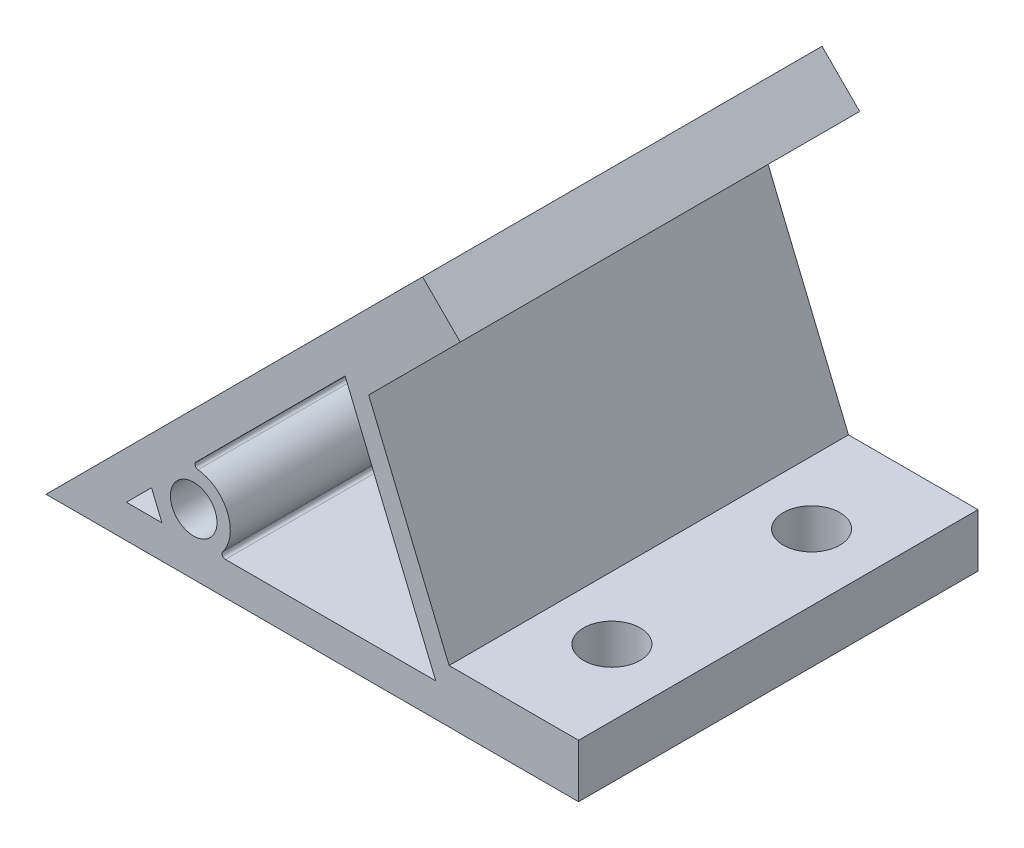
ISO-10303-21;
HEADER;
FILE_DESCRIPTION(('STEP AP214'),'2;1');
FILE_NAME('part.step','',(''),(''),'','','');
FILE_SCHEMA(('AUTOMOTIVE_DESIGN { 1 0 10303 214 1 1 1 1 }'));
ENDSEC;
DATA;
#1=APPLICATION_CONTEXT('core data for automotive mechanical design processes');
#2=APPLICATION_PROTOCOL_DEFINITION('international standard','automotive_design',2000,#1);
#3=PRODUCT_CONTEXT('',#1,'mechanical');
#4=PRODUCT('Part','Part','',(#3));
#5=PRODUCT_RELATED_PRODUCT_CATEGORY('part','',(#4));
#6=PRODUCT_DEFINITION_FORMATION('','',#4);
#7=PRODUCT_DEFINITION_CONTEXT('part definition',#1,'design');
#8=PRODUCT_DEFINITION('design','',#6,#7);
#9=PRODUCT_DEFINITION_SHAPE('','',#8);
#10=(LENGTH_UNIT() NAMED_UNIT(*) SI_UNIT(.MILLI.,.METRE.));
#11=(NAMED_UNIT(*) PLANE_ANGLE_UNIT() SI_UNIT($,.RADIAN.));
#12=(NAMED_UNIT(*) SI_UNIT($,.STERADIAN.) SOLID_ANGLE_UNIT());
#13=UNCERTAINTY_MEASURE_WITH_UNIT(LENGTH_MEASURE(1.E-05),#10,'distance_accuracy_value','');
#14=(GEOMETRIC_REPRESENTATION_CONTEXT(3) GLOBAL_UNCERTAINTY_ASSIGNED_CONTEXT((#13)) GLOBAL_UNIT_ASSIGNED_CONTEXT((#10,
#11,#12)) REPRESENTATION_CONTEXT('',''));
#15=CARTESIAN_POINT('',(0.,0.,0.));
#16=DIRECTION('',(0.,0.,1.));
#17=DIRECTION('',(1.,0.,0.));
#18=AXIS2_PLACEMENT_3D('',#15,#16,#17);
#19=CARTESIAN_POINT('',(80.,0.,30.));
#20=DIRECTION('',(0.,0.,1.));
#21=DIRECTION('',(1.,0.,0.));
#22=AXIS2_PLACEMENT_3D('',#19,#20,#21);
#23=PLANE('',#22);
#24=CARTESIAN_POINT('',(22.1846771867485,9.15647377294881,30.));
#25=DIRECTION('',(0.,0.,1.));
#26=DIRECTION('',(1.,0.,0.));
#27=AXIS2_PLACEMENT_3D('',#24,#25,#26);
#28=CIRCLE('',#27,3.5);
#29=CARTESIAN_POINT('',(25.6846771867485,9.15647377294881,30.));
#30=VERTEX_POINT('',#29);
#31=EDGE_CURVE('E199',#30,#30,#28,.T.);
#32=ORIENTED_EDGE('',*,*,#31,.F.);
#33=EDGE_LOOP('',(#32));
#34=FACE_BOUND('',#33,.T.);
#35=DIRECTION('',(1.,0.,0.));
#36=VECTOR('',#35,1.);
#37=CARTESIAN_POINT('',(0.,0.,30.));
#38=LINE('',#37,#36);
#39=CARTESIAN_POINT('',(0.,0.,30.));
#40=VERTEX_POINT('',#39);
#41=CARTESIAN_POINT('',(80.,0.,30.));
#42=VERTEX_POINT('',#41);
#43=EDGE_CURVE('E229',#40,#42,#38,.T.);
#44=ORIENTED_EDGE('',*,*,#43,.T.);
#45=DIRECTION('',(0.,1.,0.));
#46=VECTOR('',#45,1.);
#47=CARTESIAN_POINT('',(80.,0.,30.));
#48=LINE('',#47,#46);
#49=CARTESIAN_POINT('',(80.,8.,30.));
#50=VERTEX_POINT('',#49);
#51=EDGE_CURVE('E232',#42,#50,#48,.T.);
#52=ORIENTED_EDGE('',*,*,#51,.T.);
#53=DIRECTION('',(-1.,0.,0.));
#54=VECTOR('',#53,1.);
#55=CARTESIAN_POINT('',(60.5474313182664,8.,30.));
#56=LINE('',#55,#54);
#57=CARTESIAN_POINT('',(60.5474313182664,8.,30.));
#58=VERTEX_POINT('',#57);
#59=EDGE_CURVE('E235',#50,#58,#56,.T.);
#60=ORIENTED_EDGE('',*,*,#59,.T.);
#61=DIRECTION('',(-0.382683432365087,0.923879532511288,0.));
#62=VECTOR('',#61,1.);
#63=CARTESIAN_POINT('',(60.5474313182664,8.,30.));
#64=LINE('',#63,#62);
#65=CARTESIAN_POINT('',(48.4703535180654,37.1566450190806,30.));
#66=VERTEX_POINT('',#65);
#67=EDGE_CURVE('E237',#58,#66,#64,.T.);
#68=ORIENTED_EDGE('',*,*,#67,.T.);
#69=DIRECTION('',(0.707106781186547,0.707106781186548,0.));
#70=VECTOR('',#69,1.);
#71=CARTESIAN_POINT('',(48.4703535180654,37.1566450190806,30.));
#72=LINE('',#71,#70);
#73=CARTESIAN_POINT('',(62.2253967444162,50.9116882454314,30.));
#74=VERTEX_POINT('',#73);
#75=EDGE_CURVE('E239',#66,#74,#72,.T.);
#76=ORIENTED_EDGE('',*,*,#75,.T.);
#77=DIRECTION('',(-0.707106781186549,0.707106781186546,0.));
#78=VECTOR('',#77,1.);
#79=CARTESIAN_POINT('',(62.2253967444162,50.9116882454314,30.));
#80=LINE('',#79,#78);
#81=CARTESIAN_POINT('',(56.5685424949237,56.5685424949239,30.));
#82=VERTEX_POINT('',#81);
#83=EDGE_CURVE('E241',#74,#82,#80,.T.);
#84=ORIENTED_EDGE('',*,*,#83,.T.);
#85=DIRECTION('',(-0.707106781186546,-0.707106781186549,0.));
#86=VECTOR('',#85,1.);
#87=CARTESIAN_POINT('',(0.,0.,30.));
#88=LINE('',#87,#86);
#89=EDGE_CURVE('E243',#82,#40,#88,.T.);
#90=ORIENTED_EDGE('',*,*,#89,.T.);
#91=EDGE_LOOP('',(#44,#52,#60,#68,#76,#84,#90));
#92=FACE_BOUND('',#91,.T.);
#93=DIRECTION('',(-0.382683432365087,0.923879532511288,0.));
#94=VECTOR('',#93,1.);
#95=CARTESIAN_POINT('',(15.8476713770087,8.77660356514327,30.));
#96=LINE('',#95,#94);
#97=CARTESIAN_POINT('',(17.4119917933976,5.,30.));
#98=VERTEX_POINT('',#97);
#99=CARTESIAN_POINT('',(15.8476713770087,8.77660356514327,30.));
#100=VERTEX_POINT('',#99);
#101=EDGE_CURVE('E207',#98,#100,#96,.T.);
#102=ORIENTED_EDGE('',*,*,#101,.F.);
#103=DIRECTION('',(1.,0.,0.));
#104=VECTOR('',#103,1.);
#105=CARTESIAN_POINT('',(12.0710678118655,5.,30.));
#106=LINE('',#105,#104);
#107=CARTESIAN_POINT('',(12.0710678118655,5.,30.));
#108=VERTEX_POINT('',#107);
#109=EDGE_CURVE('E205',#108,#98,#106,.T.);
#110=ORIENTED_EDGE('',*,*,#109,.F.);
#111=DIRECTION('',(-0.707106781186543,-0.707106781186552,0.));
#112=VECTOR('',#111,1.);
#113=CARTESIAN_POINT('',(12.0710678118655,5.,30.));
#114=LINE('',#113,#112);
#115=EDGE_CURVE('E211',#100,#108,#114,.T.);
#116=ORIENTED_EDGE('',*,*,#115,.F.);
#117=EDGE_LOOP('',(#102,#110,#116));
#118=FACE_BOUND('',#117,.T.);
#119=DIRECTION('',(1.,0.,0.));
#120=VECTOR('',#119,1.);
#121=CARTESIAN_POINT('',(26.9417981172838,5.,30.));
#122=LINE('',#121,#120);
#123=CARTESIAN_POINT('',(26.9417981172838,5.,30.));
#124=VERTEX_POINT('',#123);
#125=CARTESIAN_POINT('',(58.5428954045085,5.,30.));
#126=VERTEX_POINT('',#125);
#127=EDGE_CURVE('E154',#124,#126,#122,.T.);
#128=ORIENTED_EDGE('',*,*,#127,.F.);
#129=CARTESIAN_POINT('',(26.9417981172838,5.5,30.));
#130=DIRECTION('',(0.,0.,1.));
#131=DIRECTION('',(-1.,0.,0.));
#132=AXIS2_PLACEMENT_3D('',#129,#130,#131);
#133=CIRCLE('',#132,0.5);
#134=CARTESIAN_POINT('',(26.5453713730726,5.80470614774571,30.));
#135=VERTEX_POINT('',#134);
#136=EDGE_CURVE('E146',#135,#124,#133,.T.);
#137=ORIENTED_EDGE('',*,*,#136,.F.);
#138=CARTESIAN_POINT('',(22.1846771867485,9.15647377294881,30.));
#139=DIRECTION('',(0.,0.,-1.));
#140=DIRECTION('',(1.,0.,0.));
#141=AXIS2_PLACEMENT_3D('',#138,#139,#140);
#142=CIRCLE('',#141,5.5);
#143=CARTESIAN_POINT('',(22.8337204048437,14.6180434100627,30.));
#144=VERTEX_POINT('',#143);
#145=EDGE_CURVE('E176',#144,#135,#142,.T.);
#146=ORIENTED_EDGE('',*,*,#145,.F.);
#147=CARTESIAN_POINT('',(22.8927243337614,15.1145497407095,30.));
#148=DIRECTION('',(0.,0.,1.));
#149=DIRECTION('',(1.,0.,0.));
#150=AXIS2_PLACEMENT_3D('',#147,#148,#149);
#151=CIRCLE('',#150,0.500000000000001);
#152=CARTESIAN_POINT('',(22.5391709431682,15.4681031313028,30.));
#153=VERTEX_POINT('',#152);
#154=EDGE_CURVE('E174',#153,#144,#151,.T.);
#155=ORIENTED_EDGE('',*,*,#154,.F.);
#156=DIRECTION('',(-0.707106781186546,-0.707106781186549,0.));
#157=VECTOR('',#156,1.);
#158=CARTESIAN_POINT('',(22.5391709431682,15.4681031313028,30.));
#159=LINE('',#158,#157);
#160=CARTESIAN_POINT('',(44.9316122367555,37.8605444248902,30.));
#161=VERTEX_POINT('',#160);
#162=EDGE_CURVE('E169',#161,#153,#159,.T.);
#163=ORIENTED_EDGE('',*,*,#162,.F.);
#164=DIRECTION('',(-0.382683432365087,0.923879532511288,0.));
#165=VECTOR('',#164,1.);
#166=CARTESIAN_POINT('',(58.5428954045085,5.,30.));
#167=LINE('',#166,#165);
#168=EDGE_CURVE('E167',#126,#161,#167,.T.);
#169=ORIENTED_EDGE('',*,*,#168,.F.);
#170=EDGE_LOOP('',(#128,#137,#146,#155,#163,#169));
#171=FACE_BOUND('',#170,.T.);
#172=ADVANCED_FACE('F31',(#34,#92,#118,#171),#23,.T.);
#173=CARTESIAN_POINT('',(80.,0.,-30.));
#174=DIRECTION('',(0.,0.,1.));
#175=DIRECTION('',(1.,0.,0.));
#176=AXIS2_PLACEMENT_3D('',#173,#174,#175);
#177=PLANE('',#176);
#178=CARTESIAN_POINT('',(22.1846771867485,9.15647377294881,-30.));
#179=DIRECTION('',(0.,0.,1.));
#180=DIRECTION('',(1.,0.,0.));
#181=AXIS2_PLACEMENT_3D('',#178,#179,#180);
#182=CIRCLE('',#181,3.5);
#183=CARTESIAN_POINT('',(25.6846771867485,9.15647377294881,-30.));
#184=VERTEX_POINT('',#183);
#185=EDGE_CURVE('E162',#184,#184,#182,.T.);
#186=ORIENTED_EDGE('',*,*,#185,.T.);
#187=EDGE_LOOP('',(#186));
#188=FACE_BOUND('',#187,.T.);
#189=DIRECTION('',(1.,0.,0.));
#190=VECTOR('',#189,1.);
#191=CARTESIAN_POINT('',(0.,0.,-30.));
#192=LINE('',#191,#190);
#193=CARTESIAN_POINT('',(0.,0.,-30.));
#194=VERTEX_POINT('',#193);
#195=CARTESIAN_POINT('',(80.,0.,-30.));
#196=VERTEX_POINT('',#195);
#197=EDGE_CURVE('E228',#194,#196,#192,.T.);
#198=ORIENTED_EDGE('',*,*,#197,.F.);
#199=DIRECTION('',(-0.707106781186546,-0.707106781186549,0.));
#200=VECTOR('',#199,1.);
#201=CARTESIAN_POINT('',(0.,0.,-30.));
#202=LINE('',#201,#200);
#203=CARTESIAN_POINT('',(56.5685424949237,56.5685424949239,-30.));
#204=VERTEX_POINT('',#203);
#205=EDGE_CURVE('E233',#204,#194,#202,.T.);
#206=ORIENTED_EDGE('',*,*,#205,.F.);
#207=DIRECTION('',(-0.707106781186549,0.707106781186546,0.));
#208=VECTOR('',#207,1.);
#209=CARTESIAN_POINT('',(62.2253967444162,50.9116882454314,-30.));
#210=LINE('',#209,#208);
#211=CARTESIAN_POINT('',(62.2253967444162,50.9116882454314,-30.));
#212=VERTEX_POINT('',#211);
#213=EDGE_CURVE('E256',#212,#204,#210,.T.);
#214=ORIENTED_EDGE('',*,*,#213,.F.);
#215=DIRECTION('',(0.707106781186547,0.707106781186548,0.));
#216=VECTOR('',#215,1.);
#217=CARTESIAN_POINT('',(48.4703535180654,37.1566450190806,-30.));
#218=LINE('',#217,#216);
#219=CARTESIAN_POINT('',(48.4703535180654,37.1566450190806,-30.));
#220=VERTEX_POINT('',#219);
#221=EDGE_CURVE('E254',#220,#212,#218,.T.);
#222=ORIENTED_EDGE('',*,*,#221,.F.);
#223=DIRECTION('',(-0.382683432365087,0.923879532511288,0.));
#224=VECTOR('',#223,1.);
#225=CARTESIAN_POINT('',(60.5474313182664,8.,-30.));
#226=LINE('',#225,#224);
#227=CARTESIAN_POINT('',(60.5474313182664,8.,-30.));
#228=VERTEX_POINT('',#227);
#229=EDGE_CURVE('E252',#228,#220,#226,.T.);
#230=ORIENTED_EDGE('',*,*,#229,.F.);
#231=DIRECTION('',(-1.,0.,0.));
#232=VECTOR('',#231,1.);
#233=CARTESIAN_POINT('',(60.5474313182664,8.,-30.));
#234=LINE('',#233,#232);
#235=CARTESIAN_POINT('',(80.,8.,-30.));
#236=VERTEX_POINT('',#235);
#237=EDGE_CURVE('E250',#236,#228,#234,.T.);
#238=ORIENTED_EDGE('',*,*,#237,.F.);
#239=DIRECTION('',(0.,1.,0.));
#240=VECTOR('',#239,1.);
#241=CARTESIAN_POINT('',(80.,0.,-30.));
#242=LINE('',#241,#240);
#243=EDGE_CURVE('E248',#196,#236,#242,.T.);
#244=ORIENTED_EDGE('',*,*,#243,.F.);
#245=EDGE_LOOP('',(#198,#206,#214,#222,#230,#238,#244));
#246=FACE_BOUND('',#245,.T.);
#247=DIRECTION('',(1.,0.,0.));
#248=VECTOR('',#247,1.);
#249=CARTESIAN_POINT('',(12.0710678118655,5.,-30.));
#250=LINE('',#249,#248);
#251=CARTESIAN_POINT('',(12.0710678118655,5.,-30.));
#252=VERTEX_POINT('',#251);
#253=CARTESIAN_POINT('',(17.4119917933976,5.,-30.));
#254=VERTEX_POINT('',#253);
#255=EDGE_CURVE('E202',#252,#254,#250,.T.);
#256=ORIENTED_EDGE('',*,*,#255,.T.);
#257=DIRECTION('',(-0.382683432365087,0.923879532511288,0.));
#258=VECTOR('',#257,1.);
#259=CARTESIAN_POINT('',(15.8476713770087,8.77660356514327,-30.));
#260=LINE('',#259,#258);
#261=CARTESIAN_POINT('',(15.8476713770087,8.77660356514327,-30.));
#262=VERTEX_POINT('',#261);
#263=EDGE_CURVE('E216',#254,#262,#260,.T.);
#264=ORIENTED_EDGE('',*,*,#263,.T.);
#265=DIRECTION('',(-0.707106781186543,-0.707106781186552,0.));
#266=VECTOR('',#265,1.);
#267=CARTESIAN_POINT('',(12.0710678118655,5.,-30.));
#268=LINE('',#267,#266);
#269=EDGE_CURVE('E208',#262,#252,#268,.T.);
#270=ORIENTED_EDGE('',*,*,#269,.T.);
#271=EDGE_LOOP('',(#256,#264,#270));
#272=FACE_BOUND('',#271,.T.);
#273=CARTESIAN_POINT('',(26.9417981172838,5.5,-30.));
#274=DIRECTION('',(0.,0.,1.));
#275=DIRECTION('',(-1.,0.,0.));
#276=AXIS2_PLACEMENT_3D('',#273,#274,#275);
#277=CIRCLE('',#276,0.5);
#278=CARTESIAN_POINT('',(26.5453713730726,5.8047061477457,-30.));
#279=VERTEX_POINT('',#278);
#280=CARTESIAN_POINT('',(26.9417981172838,5.,-30.));
#281=VERTEX_POINT('',#280);
#282=EDGE_CURVE('E56',#279,#281,#277,.T.);
#283=ORIENTED_EDGE('',*,*,#282,.T.);
#284=DIRECTION('',(1.,0.,0.));
#285=VECTOR('',#284,1.);
#286=CARTESIAN_POINT('',(26.9417981172838,5.,-30.));
#287=LINE('',#286,#285);
#288=CARTESIAN_POINT('',(58.5428954045085,5.,-30.));
#289=VERTEX_POINT('',#288);
#290=EDGE_CURVE('E161',#281,#289,#287,.T.);
#291=ORIENTED_EDGE('',*,*,#290,.T.);
#292=DIRECTION('',(-0.382683432365087,0.923879532511288,0.));
#293=VECTOR('',#292,1.);
#294=CARTESIAN_POINT('',(58.5428954045085,5.,-30.));
#295=LINE('',#294,#293);
#296=CARTESIAN_POINT('',(44.9316122367555,37.8605444248902,-30.));
#297=VERTEX_POINT('',#296);
#298=EDGE_CURVE('E181',#289,#297,#295,.T.);
#299=ORIENTED_EDGE('',*,*,#298,.T.);
#300=DIRECTION('',(-0.707106781186546,-0.707106781186549,0.));
#301=VECTOR('',#300,1.);
#302=CARTESIAN_POINT('',(22.5391709431682,15.4681031313028,-30.));
#303=LINE('',#302,#301);
#304=CARTESIAN_POINT('',(22.5391709431682,15.4681031313028,-30.));
#305=VERTEX_POINT('',#304);
#306=EDGE_CURVE('E184',#297,#305,#303,.T.);
#307=ORIENTED_EDGE('',*,*,#306,.T.);
#308=CARTESIAN_POINT('',(22.8927243337614,15.1145497407095,-30.));
#309=DIRECTION('',(0.,0.,1.));
#310=DIRECTION('',(1.,0.,0.));
#311=AXIS2_PLACEMENT_3D('',#308,#309,#310);
#312=CIRCLE('',#311,0.500000000000001);
#313=CARTESIAN_POINT('',(22.8337204048437,14.6180434100628,-30.));
#314=VERTEX_POINT('',#313);
#315=EDGE_CURVE('E187',#305,#314,#312,.T.);
#316=ORIENTED_EDGE('',*,*,#315,.T.);
#317=CARTESIAN_POINT('',(22.1846771867485,9.15647377294881,-30.));
#318=DIRECTION('',(0.,0.,-1.));
#319=DIRECTION('',(1.,0.,0.));
#320=AXIS2_PLACEMENT_3D('',#317,#318,#319);
#321=CIRCLE('',#320,5.5);
#322=EDGE_CURVE('E155',#314,#279,#321,.T.);
#323=ORIENTED_EDGE('',*,*,#322,.T.);
#324=EDGE_LOOP('',(#283,#291,#299,#307,#316,#323));
#325=FACE_BOUND('',#324,.T.);
#326=ADVANCED_FACE('F317',(#188,#246,#272,#325),#177,.F.);
#327=CARTESIAN_POINT('',(0.,0.,30.));
#328=DIRECTION('',(0.,1.,0.));
#329=DIRECTION('',(0.,0.,1.));
#330=AXIS2_PLACEMENT_3D('',#327,#328,#329);
#331=PLANE('',#330);
#332=CARTESIAN_POINT('',(70.,0.,-15.));
#333=DIRECTION('',(0.,-1.,0.));
#334=DIRECTION('',(0.,0.,-1.));
#335=AXIS2_PLACEMENT_3D('',#332,#333,#334);
#336=CIRCLE('',#335,4.25000000000001);
#337=CARTESIAN_POINT('',(70.,0.,-19.25));
#338=VERTEX_POINT('',#337);
#339=EDGE_CURVE('E288',#338,#338,#336,.T.);
#340=ORIENTED_EDGE('',*,*,#339,.F.);
#341=EDGE_LOOP('',(#340));
#342=FACE_BOUND('',#341,.T.);
#343=CARTESIAN_POINT('',(70.,0.,15.));
#344=DIRECTION('',(0.,-1.,0.));
#345=DIRECTION('',(0.,0.,-1.));
#346=AXIS2_PLACEMENT_3D('',#343,#344,#345);
#347=CIRCLE('',#346,4.25000000000001);
#348=CARTESIAN_POINT('',(70.,0.,10.75));
#349=VERTEX_POINT('',#348);
#350=EDGE_CURVE('E277',#349,#349,#347,.T.);
#351=ORIENTED_EDGE('',*,*,#350,.F.);
#352=EDGE_LOOP('',(#351));
#353=FACE_BOUND('',#352,.T.);
#354=ORIENTED_EDGE('',*,*,#197,.T.);
#355=DIRECTION('',(0.,0.,-1.));
#356=VECTOR('',#355,1.);
#357=CARTESIAN_POINT('',(80.,0.,30.));
#358=LINE('',#357,#356);
#359=EDGE_CURVE('E11',#42,#196,#358,.T.);
#360=ORIENTED_EDGE('',*,*,#359,.F.);
#361=ORIENTED_EDGE('',*,*,#43,.F.);
#362=DIRECTION('',(0.,0.,-1.));
#363=VECTOR('',#362,1.);
#364=CARTESIAN_POINT('',(0.,0.,30.));
#365=LINE('',#364,#363);
#366=EDGE_CURVE('E245',#40,#194,#365,.T.);
#367=ORIENTED_EDGE('',*,*,#366,.T.);
#368=EDGE_LOOP('',(#354,#360,#361,#367));
#369=FACE_BOUND('',#368,.T.);
#370=ADVANCED_FACE('F33',(#342,#353,#369),#331,.F.);
#371=CARTESIAN_POINT('',(80.,0.,30.));
#372=DIRECTION('',(-1.,0.,0.));
#373=DIRECTION('',(0.,0.,1.));
#374=AXIS2_PLACEMENT_3D('',#371,#372,#373);
#375=PLANE('',#374);
#376=ORIENTED_EDGE('',*,*,#243,.T.);
#377=DIRECTION('',(0.,0.,-1.));
#378=VECTOR('',#377,1.);
#379=CARTESIAN_POINT('',(80.,8.,30.));
#380=LINE('',#379,#378);
#381=EDGE_CURVE('E40',#50,#236,#380,.T.);
#382=ORIENTED_EDGE('',*,*,#381,.F.);
#383=ORIENTED_EDGE('',*,*,#51,.F.);
#384=ORIENTED_EDGE('',*,*,#359,.T.);
#385=EDGE_LOOP('',(#376,#382,#383,#384));
#386=FACE_BOUND('',#385,.T.);
#387=ADVANCED_FACE('F348',(#386),#375,.F.);
#388=CARTESIAN_POINT('',(60.5474313182664,8.,30.));
#389=DIRECTION('',(0.,-1.,0.));
#390=DIRECTION('',(0.,0.,-1.));
#391=AXIS2_PLACEMENT_3D('',#388,#389,#390);
#392=PLANE('',#391);
#393=CARTESIAN_POINT('',(70.,8.,-15.));
#394=DIRECTION('',(0.,-1.,0.));
#395=DIRECTION('',(0.,0.,-1.));
#396=AXIS2_PLACEMENT_3D('',#393,#394,#395);
#397=CIRCLE('',#396,4.25000000000001);
#398=CARTESIAN_POINT('',(70.,8.,-19.25));
#399=VERTEX_POINT('',#398);
#400=EDGE_CURVE('E35',#399,#399,#397,.T.);
#401=ORIENTED_EDGE('',*,*,#400,.T.);
#402=EDGE_LOOP('',(#401));
#403=FACE_BOUND('',#402,.T.);
#404=CARTESIAN_POINT('',(70.,8.,15.));
#405=DIRECTION('',(0.,-1.,0.));
#406=DIRECTION('',(0.,0.,-1.));
#407=AXIS2_PLACEMENT_3D('',#404,#405,#406);
#408=CIRCLE('',#407,4.25000000000001);
#409=CARTESIAN_POINT('',(70.,8.,10.75));
#410=VERTEX_POINT('',#409);
#411=EDGE_CURVE('E274',#410,#410,#408,.T.);
#412=ORIENTED_EDGE('',*,*,#411,.T.);
#413=EDGE_LOOP('',(#412));
#414=FACE_BOUND('',#413,.T.);
#415=ORIENTED_EDGE('',*,*,#237,.T.);
#416=DIRECTION('',(0.,0.,-1.));
#417=VECTOR('',#416,1.);
#418=CARTESIAN_POINT('',(60.5474313182664,8.,30.));
#419=LINE('',#418,#417);
#420=EDGE_CURVE('E270',#58,#228,#419,.T.);
#421=ORIENTED_EDGE('',*,*,#420,.F.);
#422=ORIENTED_EDGE('',*,*,#59,.F.);
#423=ORIENTED_EDGE('',*,*,#381,.T.);
#424=EDGE_LOOP('',(#415,#421,#422,#423));
#425=FACE_BOUND('',#424,.T.);
#426=ADVANCED_FACE('F345',(#403,#414,#425),#392,.F.);
#427=CARTESIAN_POINT('',(60.5474313182664,8.,30.));
#428=DIRECTION('',(-0.923879532511288,-0.382683432365087,0.));
#429=DIRECTION('',(0.382683432365087,-0.923879532511288,0.));
#430=AXIS2_PLACEMENT_3D('',#427,#428,#429);
#431=PLANE('',#430);
#432=ORIENTED_EDGE('',*,*,#229,.T.);
#433=DIRECTION('',(0.,0.,-1.));
#434=VECTOR('',#433,1.);
#435=CARTESIAN_POINT('',(48.4703535180654,37.1566450190806,30.));
#436=LINE('',#435,#434);
#437=EDGE_CURVE('E267',#66,#220,#436,.T.);
#438=ORIENTED_EDGE('',*,*,#437,.F.);
#439=ORIENTED_EDGE('',*,*,#67,.F.);
#440=ORIENTED_EDGE('',*,*,#420,.T.);
#441=EDGE_LOOP('',(#432,#438,#439,#440));
#442=FACE_BOUND('',#441,.T.);
#443=ADVANCED_FACE('F341',(#442),#431,.F.);
#444=CARTESIAN_POINT('',(48.4703535180654,37.1566450190806,30.));
#445=DIRECTION('',(-0.707106781186548,0.707106781186547,0.));
#446=DIRECTION('',(-0.707106781186547,-0.707106781186548,0.));
#447=AXIS2_PLACEMENT_3D('',#444,#445,#446);
#448=PLANE('',#447);
#449=CARTESIAN_POINT('',(55.1543289325507,43.840620433566,15.));
#450=DIRECTION('',(-0.707106781186548,0.707106781186547,0.));
#451=DIRECTION('',(-0.707106781186547,-0.707106781186548,0.));
#452=AXIS2_PLACEMENT_3D('',#449,#450,#451);
#453=CIRCLE('',#452,4.25);
#454=CARTESIAN_POINT('',(52.1491251125079,40.8354166135231,15.));
#455=VERTEX_POINT('',#454);
#456=EDGE_CURVE('E281',#455,#455,#453,.T.);
#457=ORIENTED_EDGE('',*,*,#456,.T.);
#458=EDGE_LOOP('',(#457));
#459=FACE_BOUND('',#458,.T.);
#460=CARTESIAN_POINT('',(55.1543289325507,43.840620433566,-15.));
#461=DIRECTION('',(-0.707106781186548,0.707106781186547,0.));
#462=DIRECTION('',(-0.707106781186547,-0.707106781186548,0.));
#463=AXIS2_PLACEMENT_3D('',#460,#461,#462);
#464=CIRCLE('',#463,4.25);
#465=CARTESIAN_POINT('',(52.1491251125079,40.8354166135231,-15.));
#466=VERTEX_POINT('',#465);
#467=EDGE_CURVE('E179',#466,#466,#464,.T.);
#468=ORIENTED_EDGE('',*,*,#467,.T.);
#469=EDGE_LOOP('',(#468));
#470=FACE_BOUND('',#469,.T.);
#471=ORIENTED_EDGE('',*,*,#221,.T.);
#472=DIRECTION('',(0.,0.,-1.));
#473=VECTOR('',#472,1.);
#474=CARTESIAN_POINT('',(62.2253967444162,50.9116882454314,30.));
#475=LINE('',#474,#473);
#476=EDGE_CURVE('E264',#74,#212,#475,.T.);
#477=ORIENTED_EDGE('',*,*,#476,.F.);
#478=ORIENTED_EDGE('',*,*,#75,.F.);
#479=ORIENTED_EDGE('',*,*,#437,.T.);
#480=EDGE_LOOP('',(#471,#477,#478,#479));
#481=FACE_BOUND('',#480,.T.);
#482=ADVANCED_FACE('F298',(#459,#470,#481),#448,.F.);
#483=CARTESIAN_POINT('',(62.2253967444162,50.9116882454314,30.));
#484=DIRECTION('',(-0.707106781186546,-0.707106781186549,0.));
#485=DIRECTION('',(0.707106781186549,-0.707106781186546,0.));
#486=AXIS2_PLACEMENT_3D('',#483,#484,#485);
#487=PLANE('',#486);
#488=ORIENTED_EDGE('',*,*,#213,.T.);
#489=DIRECTION('',(0.,0.,-1.));
#490=VECTOR('',#489,1.);
#491=CARTESIAN_POINT('',(56.5685424949237,56.5685424949239,30.));
#492=LINE('',#491,#490);
#493=EDGE_CURVE('E261',#82,#204,#492,.T.);
#494=ORIENTED_EDGE('',*,*,#493,.F.);
#495=ORIENTED_EDGE('',*,*,#83,.F.);
#496=ORIENTED_EDGE('',*,*,#476,.T.);
#497=EDGE_LOOP('',(#488,#494,#495,#496));
#498=FACE_BOUND('',#497,.T.);
#499=ADVANCED_FACE('F334',(#498),#487,.F.);
#500=CARTESIAN_POINT('',(0.,0.,30.));
#501=DIRECTION('',(0.707106781186549,-0.707106781186546,0.));
#502=DIRECTION('',(0.707106781186546,0.707106781186549,0.));
#503=AXIS2_PLACEMENT_3D('',#500,#501,#502);
#504=PLANE('',#503);
#505=CARTESIAN_POINT('',(49.4974746830583,49.4974746830584,15.));
#506=DIRECTION('',(-0.707106781186549,0.707106781186546,0.));
#507=DIRECTION('',(-0.707106781186546,-0.707106781186549,0.));
#508=AXIS2_PLACEMENT_3D('',#505,#506,#507);
#509=CIRCLE('',#508,4.25);
#510=CARTESIAN_POINT('',(46.4922708630154,46.4922708630156,15.));
#511=VERTEX_POINT('',#510);
#512=EDGE_CURVE('E276',#511,#511,#509,.T.);
#513=ORIENTED_EDGE('',*,*,#512,.F.);
#514=EDGE_LOOP('',(#513));
#515=FACE_BOUND('',#514,.T.);
#516=CARTESIAN_POINT('',(49.4974746830583,49.4974746830584,-15.));
#517=DIRECTION('',(-0.707106781186549,0.707106781186546,0.));
#518=DIRECTION('',(-0.707106781186546,-0.707106781186549,0.));
#519=AXIS2_PLACEMENT_3D('',#516,#517,#518);
#520=CIRCLE('',#519,4.25);
#521=CARTESIAN_POINT('',(46.4922708630154,46.4922708630156,-15.));
#522=VERTEX_POINT('',#521);
#523=EDGE_CURVE('E293',#522,#522,#520,.T.);
#524=ORIENTED_EDGE('',*,*,#523,.F.);
#525=EDGE_LOOP('',(#524));
#526=FACE_BOUND('',#525,.T.);
#527=ORIENTED_EDGE('',*,*,#205,.T.);
#528=ORIENTED_EDGE('',*,*,#366,.F.);
#529=ORIENTED_EDGE('',*,*,#89,.F.);
#530=ORIENTED_EDGE('',*,*,#493,.T.);
#531=EDGE_LOOP('',(#527,#528,#529,#530));
#532=FACE_BOUND('',#531,.T.);
#533=ADVANCED_FACE('F331',(#515,#526,#532),#504,.F.);
#534=CARTESIAN_POINT('',(12.0710678118655,5.,30.));
#535=DIRECTION('',(0.,1.,0.));
#536=DIRECTION('',(0.,0.,1.));
#537=AXIS2_PLACEMENT_3D('',#534,#535,#536);
#538=PLANE('',#537);
#539=ORIENTED_EDGE('',*,*,#255,.F.);
#540=DIRECTION('',(0.,0.,-1.));
#541=VECTOR('',#540,1.);
#542=CARTESIAN_POINT('',(12.0710678118655,5.,30.));
#543=LINE('',#542,#541);
#544=EDGE_CURVE('E213',#108,#252,#543,.T.);
#545=ORIENTED_EDGE('',*,*,#544,.F.);
#546=ORIENTED_EDGE('',*,*,#109,.T.);
#547=DIRECTION('',(0.,0.,-1.));
#548=VECTOR('',#547,1.);
#549=CARTESIAN_POINT('',(17.4119917933976,5.,30.));
#550=LINE('',#549,#548);
#551=EDGE_CURVE('E225',#98,#254,#550,.T.);
#552=ORIENTED_EDGE('',*,*,#551,.T.);
#553=EDGE_LOOP('',(#539,#545,#546,#552));
#554=FACE_BOUND('',#553,.T.);
#555=ADVANCED_FACE('F328',(#554),#538,.T.);
#556=CARTESIAN_POINT('',(15.8476713770087,8.77660356514327,30.));
#557=DIRECTION('',(-0.923879532511288,-0.382683432365087,0.));
#558=DIRECTION('',(0.382683432365087,-0.923879532511288,0.));
#559=AXIS2_PLACEMENT_3D('',#556,#557,#558);
#560=PLANE('',#559);
#561=ORIENTED_EDGE('',*,*,#263,.F.);
#562=ORIENTED_EDGE('',*,*,#551,.F.);
#563=ORIENTED_EDGE('',*,*,#101,.T.);
#564=DIRECTION('',(0.,0.,-1.));
#565=VECTOR('',#564,1.);
#566=CARTESIAN_POINT('',(15.8476713770087,8.77660356514327,30.));
#567=LINE('',#566,#565);
#568=EDGE_CURVE('E223',#100,#262,#567,.T.);
#569=ORIENTED_EDGE('',*,*,#568,.T.);
#570=EDGE_LOOP('',(#561,#562,#563,#569));
#571=FACE_BOUND('',#570,.T.);
#572=ADVANCED_FACE('F386',(#571),#560,.T.);
#573=CARTESIAN_POINT('',(12.0710678118655,5.,30.));
#574=DIRECTION('',(0.707106781186552,-0.707106781186543,0.));
#575=DIRECTION('',(0.707106781186543,0.707106781186552,0.));
#576=AXIS2_PLACEMENT_3D('',#573,#574,#575);
#577=PLANE('',#576);
#578=ORIENTED_EDGE('',*,*,#269,.F.);
#579=ORIENTED_EDGE('',*,*,#568,.F.);
#580=ORIENTED_EDGE('',*,*,#115,.T.);
#581=ORIENTED_EDGE('',*,*,#544,.T.);
#582=EDGE_LOOP('',(#578,#579,#580,#581));
#583=FACE_BOUND('',#582,.T.);
#584=ADVANCED_FACE('F392',(#583),#577,.T.);
#585=CARTESIAN_POINT('',(22.1846771867485,9.15647377294881,30.));
#586=DIRECTION('',(0.,0.,-1.));
#587=DIRECTION('',(-1.,0.,0.));
#588=AXIS2_PLACEMENT_3D('',#585,#586,#587);
#589=CYLINDRICAL_SURFACE('',#588,3.5);
#590=ORIENTED_EDGE('',*,*,#31,.T.);
#591=EDGE_LOOP('',(#590));
#592=FACE_BOUND('',#591,.T.);
#593=ORIENTED_EDGE('',*,*,#185,.F.);
#594=EDGE_LOOP('',(#593));
#595=FACE_BOUND('',#594,.T.);
#596=ADVANCED_FACE('F394',(#592,#595),#589,.F.);
#597=CARTESIAN_POINT('',(26.9417981172838,5.5,30.));
#598=DIRECTION('',(0.,0.,-1.));
#599=DIRECTION('',(-1.,0.,0.));
#600=AXIS2_PLACEMENT_3D('',#597,#598,#599);
#601=CYLINDRICAL_SURFACE('',#600,0.5);
#602=ORIENTED_EDGE('',*,*,#282,.F.);
#603=DIRECTION('',(0.,0.,-1.));
#604=VECTOR('',#603,1.);
#605=CARTESIAN_POINT('',(26.5453713730726,5.80470614774571,30.));
#606=LINE('',#605,#604);
#607=EDGE_CURVE('E150',#135,#279,#606,.T.);
#608=ORIENTED_EDGE('',*,*,#607,.F.);
#609=ORIENTED_EDGE('',*,*,#136,.T.);
#610=DIRECTION('',(0.,0.,-1.));
#611=VECTOR('',#610,1.);
#612=CARTESIAN_POINT('',(26.9417981172838,5.,30.));
#613=LINE('',#612,#611);
#614=EDGE_CURVE('E149',#124,#281,#613,.T.);
#615=ORIENTED_EDGE('',*,*,#614,.T.);
#616=EDGE_LOOP('',(#602,#608,#609,#615));
#617=FACE_BOUND('',#616,.T.);
#618=ADVANCED_FACE('F148',(#617),#601,.F.);
#619=CARTESIAN_POINT('',(26.9417981172838,5.,30.));
#620=DIRECTION('',(0.,1.,0.));
#621=DIRECTION('',(-1.,0.,0.));
#622=AXIS2_PLACEMENT_3D('',#619,#620,#621);
#623=PLANE('',#622);
#624=ORIENTED_EDGE('',*,*,#290,.F.);
#625=ORIENTED_EDGE('',*,*,#614,.F.);
#626=ORIENTED_EDGE('',*,*,#127,.T.);
#627=DIRECTION('',(0.,0.,-1.));
#628=VECTOR('',#627,1.);
#629=CARTESIAN_POINT('',(58.5428954045085,5.,30.));
#630=LINE('',#629,#628);
#631=EDGE_CURVE('E163',#126,#289,#630,.T.);
#632=ORIENTED_EDGE('',*,*,#631,.T.);
#633=EDGE_LOOP('',(#624,#625,#626,#632));
#634=FACE_BOUND('',#633,.T.);
#635=ADVANCED_FACE('F158',(#634),#623,.T.);
#636=CARTESIAN_POINT('',(58.5428954045085,5.,30.));
#637=DIRECTION('',(-0.923879532511288,-0.382683432365087,0.));
#638=DIRECTION('',(0.382683432365087,-0.923879532511288,0.));
#639=AXIS2_PLACEMENT_3D('',#636,#637,#638);
#640=PLANE('',#639);
#641=ORIENTED_EDGE('',*,*,#298,.F.);
#642=ORIENTED_EDGE('',*,*,#631,.F.);
#643=ORIENTED_EDGE('',*,*,#168,.T.);
#644=DIRECTION('',(0.,0.,-1.));
#645=VECTOR('',#644,1.);
#646=CARTESIAN_POINT('',(44.9316122367555,37.8605444248902,30.));
#647=LINE('',#646,#645);
#648=EDGE_CURVE('E196',#161,#297,#647,.T.);
#649=ORIENTED_EDGE('',*,*,#648,.T.);
#650=EDGE_LOOP('',(#641,#642,#643,#649));
#651=FACE_BOUND('',#650,.T.);
#652=ADVANCED_FACE('F407',(#651),#640,.T.);
#653=CARTESIAN_POINT('',(22.5391709431682,15.4681031313028,30.));
#654=DIRECTION('',(0.707106781186549,-0.707106781186546,0.));
#655=DIRECTION('',(0.707106781186546,0.707106781186549,0.));
#656=AXIS2_PLACEMENT_3D('',#653,#654,#655);
#657=PLANE('',#656);
#658=ORIENTED_EDGE('',*,*,#306,.F.);
#659=ORIENTED_EDGE('',*,*,#648,.F.);
#660=ORIENTED_EDGE('',*,*,#162,.T.);
#661=DIRECTION('',(0.,0.,-1.));
#662=VECTOR('',#661,1.);
#663=CARTESIAN_POINT('',(22.5391709431682,15.4681031313028,30.));
#664=LINE('',#663,#662);
#665=EDGE_CURVE('E194',#153,#305,#664,.T.);
#666=ORIENTED_EDGE('',*,*,#665,.T.);
#667=EDGE_LOOP('',(#658,#659,#660,#666));
#668=FACE_BOUND('',#667,.T.);
#669=ADVANCED_FACE('F410',(#668),#657,.T.);
#670=CARTESIAN_POINT('',(22.8927243337614,15.1145497407095,30.));
#671=DIRECTION('',(0.,0.,-1.));
#672=DIRECTION('',(-1.,0.,0.));
#673=AXIS2_PLACEMENT_3D('',#670,#671,#672);
#674=CYLINDRICAL_SURFACE('',#673,0.500000000000001);
#675=ORIENTED_EDGE('',*,*,#315,.F.);
#676=ORIENTED_EDGE('',*,*,#665,.F.);
#677=ORIENTED_EDGE('',*,*,#154,.T.);
#678=DIRECTION('',(0.,0.,-1.));
#679=VECTOR('',#678,1.);
#680=CARTESIAN_POINT('',(22.8337204048437,14.6180434100628,30.));
#681=LINE('',#680,#679);
#682=EDGE_CURVE('E48',#144,#314,#681,.T.);
#683=ORIENTED_EDGE('',*,*,#682,.T.);
#684=EDGE_LOOP('',(#675,#676,#677,#683));
#685=FACE_BOUND('',#684,.T.);
#686=ADVANCED_FACE('F314',(#685),#674,.F.);
#687=CARTESIAN_POINT('',(22.1846771867485,9.15647377294881,30.));
#688=DIRECTION('',(0.,0.,-1.));
#689=DIRECTION('',(-1.,0.,0.));
#690=AXIS2_PLACEMENT_3D('',#687,#688,#689);
#691=CYLINDRICAL_SURFACE('',#690,5.5);
#692=ORIENTED_EDGE('',*,*,#322,.F.);
#693=ORIENTED_EDGE('',*,*,#682,.F.);
#694=ORIENTED_EDGE('',*,*,#145,.T.);
#695=ORIENTED_EDGE('',*,*,#607,.T.);
#696=EDGE_LOOP('',(#692,#693,#694,#695));
#697=FACE_BOUND('',#696,.T.);
#698=ADVANCED_FACE('F304',(#697),#691,.T.);
#699=CARTESIAN_POINT('',(63.6396103067892,35.3553390593275,-15.));
#700=DIRECTION('',(-0.707106781186549,0.707106781186546,0.));
#701=DIRECTION('',(-0.707106781186546,-0.707106781186549,0.));
#702=AXIS2_PLACEMENT_3D('',#699,#700,#701);
#703=CYLINDRICAL_SURFACE('',#702,4.25);
#704=ORIENTED_EDGE('',*,*,#523,.T.);
#705=EDGE_LOOP('',(#704));
#706=FACE_BOUND('',#705,.T.);
#707=ORIENTED_EDGE('',*,*,#467,.F.);
#708=EDGE_LOOP('',(#707));
#709=FACE_BOUND('',#708,.T.);
#710=ADVANCED_FACE('F301',(#706,#709),#703,.F.);
#711=CARTESIAN_POINT('',(63.6396103067892,35.3553390593275,15.));
#712=DIRECTION('',(-0.707106781186549,0.707106781186546,0.));
#713=DIRECTION('',(-0.707106781186546,-0.707106781186549,0.));
#714=AXIS2_PLACEMENT_3D('',#711,#712,#713);
#715=CYLINDRICAL_SURFACE('',#714,4.25);
#716=ORIENTED_EDGE('',*,*,#512,.T.);
#717=EDGE_LOOP('',(#716));
#718=FACE_BOUND('',#717,.T.);
#719=ORIENTED_EDGE('',*,*,#456,.F.);
#720=EDGE_LOOP('',(#719));
#721=FACE_BOUND('',#720,.T.);
#722=ADVANCED_FACE('F303',(#718,#721),#715,.F.);
#723=CARTESIAN_POINT('',(70.,20.,15.));
#724=DIRECTION('',(0.,-1.,0.));
#725=DIRECTION('',(0.,0.,-1.));
#726=AXIS2_PLACEMENT_3D('',#723,#724,#725);
#727=CYLINDRICAL_SURFACE('',#726,4.25000000000001);
#728=ORIENTED_EDGE('',*,*,#350,.T.);
#729=EDGE_LOOP('',(#728));
#730=FACE_BOUND('',#729,.T.);
#731=ORIENTED_EDGE('',*,*,#411,.F.);
#732=EDGE_LOOP('',(#731));
#733=FACE_BOUND('',#732,.T.);
#734=ADVANCED_FACE('F311',(#730,#733),#727,.F.);
#735=CARTESIAN_POINT('',(70.,20.,-15.));
#736=DIRECTION('',(0.,-1.,0.));
#737=DIRECTION('',(0.,0.,-1.));
#738=AXIS2_PLACEMENT_3D('',#735,#736,#737);
#739=CYLINDRICAL_SURFACE('',#738,4.25000000000001);
#740=ORIENTED_EDGE('',*,*,#339,.T.);
#741=EDGE_LOOP('',(#740));
#742=FACE_BOUND('',#741,.T.);
#743=ORIENTED_EDGE('',*,*,#400,.F.);
#744=EDGE_LOOP('',(#743));
#745=FACE_BOUND('',#744,.T.);
#746=ADVANCED_FACE('F480',(#742,#745),#739,.F.);
#747=CLOSED_SHELL('',(#172,#326,#370,#387,#426,#443,#482,#499,#533,#555,#572,#584,#596,#618,
#635,#652,#669,#686,#698,#710,#722,#734,#746));
#748=MANIFOLD_SOLID_BREP('B2',#747);
#749=ADVANCED_BREP_SHAPE_REPRESENTATION('',(#18,#748),#14);
#750=SHAPE_DEFINITION_REPRESENTATION(#9,#749);
ENDSEC;
END-ISO-10303-21;
